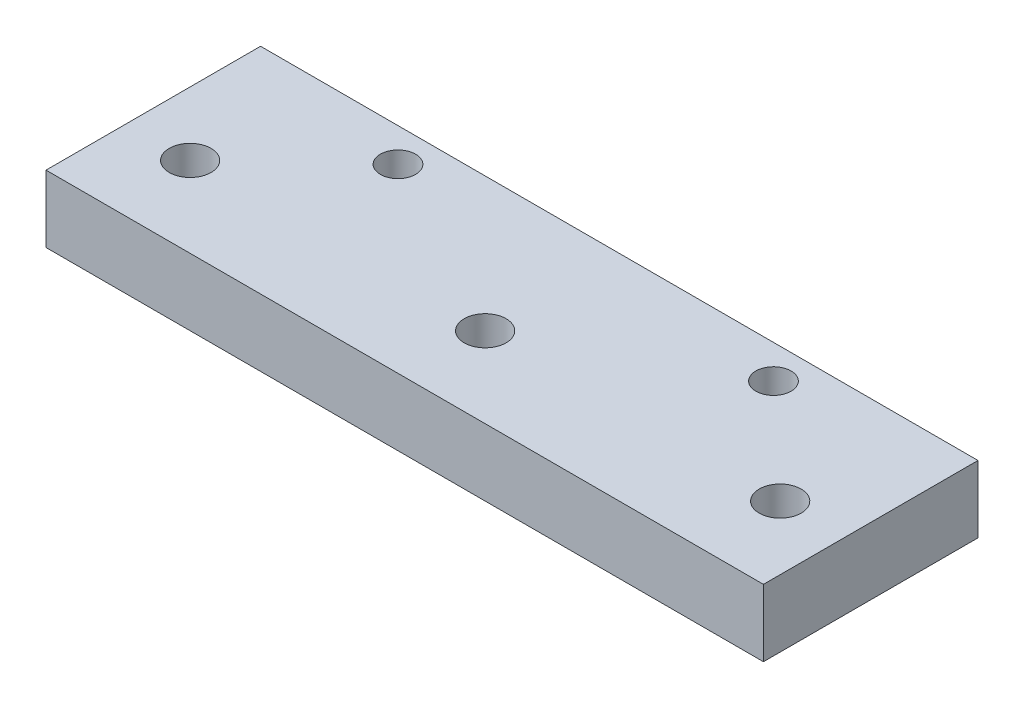
ISO-10303-21;
HEADER;
FILE_DESCRIPTION(('STEP AP214'),'2;1');
FILE_NAME('part.step','',(''),(''),'','','');
FILE_SCHEMA(('AUTOMOTIVE_DESIGN { 1 0 10303 214 1 1 1 1 }'));
ENDSEC;
DATA;
#1=APPLICATION_CONTEXT('core data for automotive mechanical design processes');
#2=APPLICATION_PROTOCOL_DEFINITION('international standard','automotive_design',2000,#1);
#3=PRODUCT_CONTEXT('',#1,'mechanical');
#4=PRODUCT('Part','Part','',(#3));
#5=PRODUCT_RELATED_PRODUCT_CATEGORY('part','',(#4));
#6=PRODUCT_DEFINITION_FORMATION('','',#4);
#7=PRODUCT_DEFINITION_CONTEXT('part definition',#1,'design');
#8=PRODUCT_DEFINITION('design','',#6,#7);
#9=PRODUCT_DEFINITION_SHAPE('','',#8);
#10=(LENGTH_UNIT() NAMED_UNIT(*) SI_UNIT(.MILLI.,.METRE.));
#11=(NAMED_UNIT(*) PLANE_ANGLE_UNIT() SI_UNIT($,.RADIAN.));
#12=(NAMED_UNIT(*) SI_UNIT($,.STERADIAN.) SOLID_ANGLE_UNIT());
#13=UNCERTAINTY_MEASURE_WITH_UNIT(LENGTH_MEASURE(1.E-05),#10,'distance_accuracy_value','');
#14=(GEOMETRIC_REPRESENTATION_CONTEXT(3) GLOBAL_UNCERTAINTY_ASSIGNED_CONTEXT((#13)) GLOBAL_UNIT_ASSIGNED_CONTEXT((#10,
#11,#12)) REPRESENTATION_CONTEXT('',''));
#15=CARTESIAN_POINT('',(0.,0.,0.));
#16=DIRECTION('',(0.,0.,1.));
#17=DIRECTION('',(1.,0.,0.));
#18=AXIS2_PLACEMENT_3D('',#15,#16,#17);
#19=CARTESIAN_POINT('',(169.8625,15.875,50.8));
#20=DIRECTION('',(-1.,0.,0.));
#21=DIRECTION('',(0.,0.,1.));
#22=AXIS2_PLACEMENT_3D('',#19,#20,#21);
#23=PLANE('',#22);
#24=DIRECTION('',(0.,0.,-1.));
#25=VECTOR('',#24,1.);
#26=CARTESIAN_POINT('',(169.8625,-15.875,50.8));
#27=LINE('',#26,#25);
#28=CARTESIAN_POINT('',(169.8625,-15.875,50.8));
#29=VERTEX_POINT('',#28);
#30=CARTESIAN_POINT('',(169.8625,-15.875,-50.8));
#31=VERTEX_POINT('',#30);
#32=EDGE_CURVE('E105',#29,#31,#27,.T.);
#33=ORIENTED_EDGE('',*,*,#32,.T.);
#34=DIRECTION('',(0.,-1.,0.));
#35=VECTOR('',#34,1.);
#36=CARTESIAN_POINT('',(169.8625,15.875,-50.8));
#37=LINE('',#36,#35);
#38=CARTESIAN_POINT('',(169.8625,15.875,-50.8));
#39=VERTEX_POINT('',#38);
#40=EDGE_CURVE('E11',#39,#31,#37,.T.);
#41=ORIENTED_EDGE('',*,*,#40,.F.);
#42=DIRECTION('',(0.,0.,-1.));
#43=VECTOR('',#42,1.);
#44=CARTESIAN_POINT('',(169.8625,15.875,50.8));
#45=LINE('',#44,#43);
#46=CARTESIAN_POINT('',(169.8625,15.875,50.8));
#47=VERTEX_POINT('',#46);
#48=EDGE_CURVE('E92',#47,#39,#45,.T.);
#49=ORIENTED_EDGE('',*,*,#48,.F.);
#50=DIRECTION('',(0.,-1.,0.));
#51=VECTOR('',#50,1.);
#52=CARTESIAN_POINT('',(169.8625,15.875,50.8));
#53=LINE('',#52,#51);
#54=EDGE_CURVE('E101',#47,#29,#53,.T.);
#55=ORIENTED_EDGE('',*,*,#54,.T.);
#56=EDGE_LOOP('',(#33,#41,#49,#55));
#57=FACE_BOUND('',#56,.T.);
#58=ADVANCED_FACE('F39',(#57),#23,.F.);
#59=CARTESIAN_POINT('',(-169.8625,15.875,-50.8));
#60=DIRECTION('',(0.,0.,1.));
#61=DIRECTION('',(1.,0.,0.));
#62=AXIS2_PLACEMENT_3D('',#59,#60,#61);
#63=PLANE('',#62);
#64=DIRECTION('',(-1.,0.,0.));
#65=VECTOR('',#64,1.);
#66=CARTESIAN_POINT('',(-169.8625,-15.875,-50.8));
#67=LINE('',#66,#65);
#68=CARTESIAN_POINT('',(-169.8625,-15.875,-50.8));
#69=VERTEX_POINT('',#68);
#70=EDGE_CURVE('E96',#31,#69,#67,.T.);
#71=ORIENTED_EDGE('',*,*,#70,.T.);
#72=DIRECTION('',(0.,-1.,0.));
#73=VECTOR('',#72,1.);
#74=CARTESIAN_POINT('',(-169.8625,15.875,-50.8));
#75=LINE('',#74,#73);
#76=CARTESIAN_POINT('',(-169.8625,15.875,-50.8));
#77=VERTEX_POINT('',#76);
#78=EDGE_CURVE('E48',#77,#69,#75,.T.);
#79=ORIENTED_EDGE('',*,*,#78,.F.);
#80=DIRECTION('',(-1.,0.,0.));
#81=VECTOR('',#80,1.);
#82=CARTESIAN_POINT('',(-169.8625,15.875,-50.8));
#83=LINE('',#82,#81);
#84=EDGE_CURVE('E87',#39,#77,#83,.T.);
#85=ORIENTED_EDGE('',*,*,#84,.F.);
#86=ORIENTED_EDGE('',*,*,#40,.T.);
#87=EDGE_LOOP('',(#71,#79,#85,#86));
#88=FACE_BOUND('',#87,.T.);
#89=ADVANCED_FACE('F95',(#88),#63,.F.);
#90=CARTESIAN_POINT('',(-169.8625,15.875,50.8));
#91=DIRECTION('',(1.,0.,0.));
#92=DIRECTION('',(0.,0.,-1.));
#93=AXIS2_PLACEMENT_3D('',#90,#91,#92);
#94=PLANE('',#93);
#95=DIRECTION('',(0.,0.,1.));
#96=VECTOR('',#95,1.);
#97=CARTESIAN_POINT('',(-169.8625,-15.875,50.8));
#98=LINE('',#97,#96);
#99=CARTESIAN_POINT('',(-169.8625,-15.875,50.8));
#100=VERTEX_POINT('',#99);
#101=EDGE_CURVE('E74',#69,#100,#98,.T.);
#102=ORIENTED_EDGE('',*,*,#101,.T.);
#103=DIRECTION('',(0.,-1.,0.));
#104=VECTOR('',#103,1.);
#105=CARTESIAN_POINT('',(-169.8625,15.875,50.8));
#106=LINE('',#105,#104);
#107=CARTESIAN_POINT('',(-169.8625,15.875,50.8));
#108=VERTEX_POINT('',#107);
#109=EDGE_CURVE('E97',#108,#100,#106,.T.);
#110=ORIENTED_EDGE('',*,*,#109,.F.);
#111=DIRECTION('',(0.,0.,1.));
#112=VECTOR('',#111,1.);
#113=CARTESIAN_POINT('',(-169.8625,15.875,50.8));
#114=LINE('',#113,#112);
#115=EDGE_CURVE('E90',#77,#108,#114,.T.);
#116=ORIENTED_EDGE('',*,*,#115,.F.);
#117=ORIENTED_EDGE('',*,*,#78,.T.);
#118=EDGE_LOOP('',(#102,#110,#116,#117));
#119=FACE_BOUND('',#118,.T.);
#120=ADVANCED_FACE('F99',(#119),#94,.F.);
#121=CARTESIAN_POINT('',(-169.8625,15.875,50.8));
#122=DIRECTION('',(0.,0.,-1.));
#123=DIRECTION('',(-1.,0.,0.));
#124=AXIS2_PLACEMENT_3D('',#121,#122,#123);
#125=PLANE('',#124);
#126=DIRECTION('',(1.,0.,0.));
#127=VECTOR('',#126,1.);
#128=CARTESIAN_POINT('',(-169.8625,-15.875,50.8));
#129=LINE('',#128,#127);
#130=EDGE_CURVE('E80',#100,#29,#129,.T.);
#131=ORIENTED_EDGE('',*,*,#130,.T.);
#132=ORIENTED_EDGE('',*,*,#54,.F.);
#133=DIRECTION('',(1.,0.,0.));
#134=VECTOR('',#133,1.);
#135=CARTESIAN_POINT('',(-169.8625,15.875,50.8));
#136=LINE('',#135,#134);
#137=EDGE_CURVE('E57',#108,#47,#136,.T.);
#138=ORIENTED_EDGE('',*,*,#137,.F.);
#139=ORIENTED_EDGE('',*,*,#109,.T.);
#140=EDGE_LOOP('',(#131,#132,#138,#139));
#141=FACE_BOUND('',#140,.T.);
#142=ADVANCED_FACE('F144',(#141),#125,.F.);
#143=CARTESIAN_POINT('',(0.,15.875,0.));
#144=DIRECTION('',(0.,-1.,0.));
#145=DIRECTION('',(0.,0.,-1.));
#146=AXIS2_PLACEMENT_3D('',#143,#144,#145);
#147=PLANE('',#146);
#148=CARTESIAN_POINT('',(-88.9127,15.875,-34.925));
#149=DIRECTION('',(0.,-1.,0.));
#150=DIRECTION('',(0.,0.,-1.));
#151=AXIS2_PLACEMENT_3D('',#148,#149,#150);
#152=CIRCLE('',#151,8.3312);
#153=CARTESIAN_POINT('',(-88.9127,15.875,-43.2562));
#154=VERTEX_POINT('',#153);
#155=EDGE_CURVE('E296',#154,#154,#152,.F.);
#156=ORIENTED_EDGE('',*,*,#155,.F.);
#157=EDGE_LOOP('',(#156));
#158=FACE_BOUND('',#157,.T.);
#159=CARTESIAN_POINT('',(88.8873,15.875,-34.925));
#160=DIRECTION('',(0.,-1.,0.));
#161=DIRECTION('',(0.,0.,-1.));
#162=AXIS2_PLACEMENT_3D('',#159,#160,#161);
#163=CIRCLE('',#162,8.3312);
#164=CARTESIAN_POINT('',(88.8873,15.875,-43.2562));
#165=VERTEX_POINT('',#164);
#166=EDGE_CURVE('E297',#165,#165,#163,.F.);
#167=ORIENTED_EDGE('',*,*,#166,.F.);
#168=EDGE_LOOP('',(#167));
#169=FACE_BOUND('',#168,.T.);
#170=CARTESIAN_POINT('',(-139.7127,15.875,12.7));
#171=DIRECTION('',(0.,-1.,0.));
#172=DIRECTION('',(0.,0.,-1.));
#173=AXIS2_PLACEMENT_3D('',#170,#171,#172);
#174=CIRCLE('',#173,9.9187);
#175=CARTESIAN_POINT('',(-139.7127,15.875,2.7813));
#176=VERTEX_POINT('',#175);
#177=EDGE_CURVE('E108',#176,#176,#174,.F.);
#178=ORIENTED_EDGE('',*,*,#177,.F.);
#179=EDGE_LOOP('',(#178));
#180=FACE_BOUND('',#179,.T.);
#181=CARTESIAN_POINT('',(-0.012699999999993,15.875,12.7));
#182=DIRECTION('',(0.,-1.,0.));
#183=DIRECTION('',(0.,0.,-1.));
#184=AXIS2_PLACEMENT_3D('',#181,#182,#183);
#185=CIRCLE('',#184,9.9187);
#186=CARTESIAN_POINT('',(-0.012699999999993,15.875,2.7813));
#187=VERTEX_POINT('',#186);
#188=EDGE_CURVE('E126',#187,#187,#185,.F.);
#189=ORIENTED_EDGE('',*,*,#188,.F.);
#190=EDGE_LOOP('',(#189));
#191=FACE_BOUND('',#190,.T.);
#192=CARTESIAN_POINT('',(139.6873,15.875,12.7));
#193=DIRECTION('',(0.,-1.,0.));
#194=DIRECTION('',(0.,0.,-1.));
#195=AXIS2_PLACEMENT_3D('',#192,#193,#194);
#196=CIRCLE('',#195,9.9187);
#197=CARTESIAN_POINT('',(139.6873,15.875,2.7813));
#198=VERTEX_POINT('',#197);
#199=EDGE_CURVE('E122',#198,#198,#196,.F.);
#200=ORIENTED_EDGE('',*,*,#199,.F.);
#201=EDGE_LOOP('',(#200));
#202=FACE_BOUND('',#201,.T.);
#203=ORIENTED_EDGE('',*,*,#48,.T.);
#204=ORIENTED_EDGE('',*,*,#84,.T.);
#205=ORIENTED_EDGE('',*,*,#115,.T.);
#206=ORIENTED_EDGE('',*,*,#137,.T.);
#207=EDGE_LOOP('',(#203,#204,#205,#206));
#208=FACE_BOUND('',#207,.T.);
#209=ADVANCED_FACE('F88',(#158,#169,#180,#191,#202,#208),#147,.F.);
#210=CARTESIAN_POINT('',(0.,-15.875,0.));
#211=DIRECTION('',(0.,-1.,0.));
#212=DIRECTION('',(0.,0.,-1.));
#213=AXIS2_PLACEMENT_3D('',#210,#211,#212);
#214=PLANE('',#213);
#215=CARTESIAN_POINT('',(-88.9127,-15.875,-34.925));
#216=DIRECTION('',(0.,1.,0.));
#217=DIRECTION('',(0.,0.,1.));
#218=AXIS2_PLACEMENT_3D('',#215,#216,#217);
#219=CIRCLE('',#218,8.3312);
#220=CARTESIAN_POINT('',(-88.9127,-15.875,-26.5938));
#221=VERTEX_POINT('',#220);
#222=EDGE_CURVE('E293',#221,#221,#219,.T.);
#223=ORIENTED_EDGE('',*,*,#222,.T.);
#224=EDGE_LOOP('',(#223));
#225=FACE_BOUND('',#224,.T.);
#226=CARTESIAN_POINT('',(88.8873,-15.875,-34.925));
#227=DIRECTION('',(0.,1.,0.));
#228=DIRECTION('',(0.,0.,1.));
#229=AXIS2_PLACEMENT_3D('',#226,#227,#228);
#230=CIRCLE('',#229,8.3312);
#231=CARTESIAN_POINT('',(88.8873,-15.875,-26.5938));
#232=VERTEX_POINT('',#231);
#233=EDGE_CURVE('E329',#232,#232,#230,.T.);
#234=ORIENTED_EDGE('',*,*,#233,.T.);
#235=EDGE_LOOP('',(#234));
#236=FACE_BOUND('',#235,.T.);
#237=CARTESIAN_POINT('',(-139.7127,-15.875,12.7));
#238=DIRECTION('',(0.,1.,0.));
#239=DIRECTION('',(0.,0.,1.));
#240=AXIS2_PLACEMENT_3D('',#237,#238,#239);
#241=CIRCLE('',#240,15.0876);
#242=CARTESIAN_POINT('',(-139.7127,-15.875,27.7876));
#243=VERTEX_POINT('',#242);
#244=EDGE_CURVE('E307',#243,#243,#241,.T.);
#245=ORIENTED_EDGE('',*,*,#244,.T.);
#246=EDGE_LOOP('',(#245));
#247=FACE_BOUND('',#246,.T.);
#248=CARTESIAN_POINT('',(-0.012699999999993,-15.875,12.7));
#249=DIRECTION('',(0.,1.,0.));
#250=DIRECTION('',(0.,0.,1.));
#251=AXIS2_PLACEMENT_3D('',#248,#249,#250);
#252=CIRCLE('',#251,15.0876);
#253=CARTESIAN_POINT('',(-0.012699999999993,-15.875,27.7876));
#254=VERTEX_POINT('',#253);
#255=EDGE_CURVE('E310',#254,#254,#252,.T.);
#256=ORIENTED_EDGE('',*,*,#255,.T.);
#257=EDGE_LOOP('',(#256));
#258=FACE_BOUND('',#257,.T.);
#259=CARTESIAN_POINT('',(139.6873,-15.875,12.7));
#260=DIRECTION('',(0.,1.,0.));
#261=DIRECTION('',(0.,0.,1.));
#262=AXIS2_PLACEMENT_3D('',#259,#260,#261);
#263=CIRCLE('',#262,15.0876);
#264=CARTESIAN_POINT('',(139.6873,-15.875,27.7876));
#265=VERTEX_POINT('',#264);
#266=EDGE_CURVE('E300',#265,#265,#263,.T.);
#267=ORIENTED_EDGE('',*,*,#266,.T.);
#268=EDGE_LOOP('',(#267));
#269=FACE_BOUND('',#268,.T.);
#270=ORIENTED_EDGE('',*,*,#32,.F.);
#271=ORIENTED_EDGE('',*,*,#130,.F.);
#272=ORIENTED_EDGE('',*,*,#101,.F.);
#273=ORIENTED_EDGE('',*,*,#70,.F.);
#274=EDGE_LOOP('',(#270,#271,#272,#273));
#275=FACE_BOUND('',#274,.T.);
#276=ADVANCED_FACE('F143',(#225,#236,#247,#258,#269,#275),#214,.T.);
#277=CARTESIAN_POINT('',(139.6873,47.625,12.7));
#278=DIRECTION('',(0.,-1.,0.));
#279=DIRECTION('',(0.,0.,-1.));
#280=AXIS2_PLACEMENT_3D('',#277,#278,#279);
#281=CYLINDRICAL_SURFACE('',#280,9.9187);
#282=CARTESIAN_POINT('',(139.6873,-12.7,12.7));
#283=DIRECTION('',(0.,1.,0.));
#284=DIRECTION('',(0.,0.,1.));
#285=AXIS2_PLACEMENT_3D('',#282,#283,#284);
#286=CIRCLE('',#285,9.9187);
#287=CARTESIAN_POINT('',(139.6873,-12.7,22.6187));
#288=VERTEX_POINT('',#287);
#289=EDGE_CURVE('E42',#288,#288,#286,.T.);
#290=ORIENTED_EDGE('',*,*,#289,.F.);
#291=EDGE_LOOP('',(#290));
#292=FACE_BOUND('',#291,.T.);
#293=ORIENTED_EDGE('',*,*,#199,.T.);
#294=EDGE_LOOP('',(#293));
#295=FACE_BOUND('',#294,.T.);
#296=ADVANCED_FACE('F152',(#292,#295),#281,.F.);
#297=CARTESIAN_POINT('',(-0.012699999999993,47.625,12.7));
#298=DIRECTION('',(0.,-1.,0.));
#299=DIRECTION('',(0.,0.,-1.));
#300=AXIS2_PLACEMENT_3D('',#297,#298,#299);
#301=CYLINDRICAL_SURFACE('',#300,9.9187);
#302=CARTESIAN_POINT('',(-0.012699999999993,-12.7,12.7));
#303=DIRECTION('',(0.,1.,0.));
#304=DIRECTION('',(0.,0.,1.));
#305=AXIS2_PLACEMENT_3D('',#302,#303,#304);
#306=CIRCLE('',#305,9.9187);
#307=CARTESIAN_POINT('',(-0.012699999999993,-12.7,22.6187));
#308=VERTEX_POINT('',#307);
#309=EDGE_CURVE('E116',#308,#308,#306,.T.);
#310=ORIENTED_EDGE('',*,*,#309,.F.);
#311=EDGE_LOOP('',(#310));
#312=FACE_BOUND('',#311,.T.);
#313=ORIENTED_EDGE('',*,*,#188,.T.);
#314=EDGE_LOOP('',(#313));
#315=FACE_BOUND('',#314,.T.);
#316=ADVANCED_FACE('F150',(#312,#315),#301,.F.);
#317=CARTESIAN_POINT('',(-139.7127,47.625,12.7));
#318=DIRECTION('',(0.,-1.,0.));
#319=DIRECTION('',(0.,0.,-1.));
#320=AXIS2_PLACEMENT_3D('',#317,#318,#319);
#321=CYLINDRICAL_SURFACE('',#320,9.9187);
#322=CARTESIAN_POINT('',(-139.7127,-12.7,12.7));
#323=DIRECTION('',(0.,1.,0.));
#324=DIRECTION('',(0.,0.,1.));
#325=AXIS2_PLACEMENT_3D('',#322,#323,#324);
#326=CIRCLE('',#325,9.9187);
#327=CARTESIAN_POINT('',(-139.7127,-12.7,22.6187));
#328=VERTEX_POINT('',#327);
#329=EDGE_CURVE('E114',#328,#328,#326,.T.);
#330=ORIENTED_EDGE('',*,*,#329,.F.);
#331=EDGE_LOOP('',(#330));
#332=FACE_BOUND('',#331,.T.);
#333=ORIENTED_EDGE('',*,*,#177,.T.);
#334=EDGE_LOOP('',(#333));
#335=FACE_BOUND('',#334,.T.);
#336=ADVANCED_FACE('F139',(#332,#335),#321,.F.);
#337=CARTESIAN_POINT('',(-139.7127,-12.7,12.7));
#338=DIRECTION('',(0.,-1.,0.));
#339=DIRECTION('',(0.,0.,-1.));
#340=AXIS2_PLACEMENT_3D('',#337,#338,#339);
#341=CYLINDRICAL_SURFACE('',#340,15.0876);
#342=CARTESIAN_POINT('',(-139.7127,-12.7,12.7));
#343=DIRECTION('',(0.,1.,0.));
#344=DIRECTION('',(0.,0.,1.));
#345=AXIS2_PLACEMENT_3D('',#342,#343,#344);
#346=CIRCLE('',#345,15.0876);
#347=CARTESIAN_POINT('',(-139.7127,-12.7,27.7876));
#348=VERTEX_POINT('',#347);
#349=EDGE_CURVE('E117',#348,#348,#346,.T.);
#350=ORIENTED_EDGE('',*,*,#349,.T.);
#351=EDGE_LOOP('',(#350));
#352=FACE_BOUND('',#351,.T.);
#353=ORIENTED_EDGE('',*,*,#244,.F.);
#354=EDGE_LOOP('',(#353));
#355=FACE_BOUND('',#354,.T.);
#356=ADVANCED_FACE('F159',(#352,#355),#341,.F.);
#357=CARTESIAN_POINT('',(-139.7127,-12.7,12.7));
#358=DIRECTION('',(0.,1.,0.));
#359=DIRECTION('',(0.,0.,1.));
#360=AXIS2_PLACEMENT_3D('',#357,#358,#359);
#361=PLANE('',#360);
#362=ORIENTED_EDGE('',*,*,#329,.T.);
#363=EDGE_LOOP('',(#362));
#364=FACE_BOUND('',#363,.T.);
#365=ORIENTED_EDGE('',*,*,#349,.F.);
#366=EDGE_LOOP('',(#365));
#367=FACE_BOUND('',#366,.T.);
#368=ADVANCED_FACE('F221',(#364,#367),#361,.F.);
#369=CARTESIAN_POINT('',(-0.012699999999993,-12.7,12.7));
#370=DIRECTION('',(0.,-1.,0.));
#371=DIRECTION('',(0.,0.,-1.));
#372=AXIS2_PLACEMENT_3D('',#369,#370,#371);
#373=CYLINDRICAL_SURFACE('',#372,15.0876);
#374=CARTESIAN_POINT('',(-0.012699999999993,-12.7,12.7));
#375=DIRECTION('',(0.,1.,0.));
#376=DIRECTION('',(0.,0.,1.));
#377=AXIS2_PLACEMENT_3D('',#374,#375,#376);
#378=CIRCLE('',#377,15.0876);
#379=CARTESIAN_POINT('',(-0.012699999999993,-12.7,27.7876));
#380=VERTEX_POINT('',#379);
#381=EDGE_CURVE('E313',#380,#380,#378,.T.);
#382=ORIENTED_EDGE('',*,*,#381,.T.);
#383=EDGE_LOOP('',(#382));
#384=FACE_BOUND('',#383,.T.);
#385=ORIENTED_EDGE('',*,*,#255,.F.);
#386=EDGE_LOOP('',(#385));
#387=FACE_BOUND('',#386,.T.);
#388=ADVANCED_FACE('F231',(#384,#387),#373,.F.);
#389=CARTESIAN_POINT('',(-0.012699999999993,-12.7,12.7));
#390=DIRECTION('',(0.,1.,0.));
#391=DIRECTION('',(0.,0.,1.));
#392=AXIS2_PLACEMENT_3D('',#389,#390,#391);
#393=PLANE('',#392);
#394=ORIENTED_EDGE('',*,*,#309,.T.);
#395=EDGE_LOOP('',(#394));
#396=FACE_BOUND('',#395,.T.);
#397=ORIENTED_EDGE('',*,*,#381,.F.);
#398=EDGE_LOOP('',(#397));
#399=FACE_BOUND('',#398,.T.);
#400=ADVANCED_FACE('F241',(#396,#399),#393,.F.);
#401=CARTESIAN_POINT('',(139.6873,-12.7,12.7));
#402=DIRECTION('',(0.,-1.,0.));
#403=DIRECTION('',(0.,0.,-1.));
#404=AXIS2_PLACEMENT_3D('',#401,#402,#403);
#405=CYLINDRICAL_SURFACE('',#404,15.0876);
#406=CARTESIAN_POINT('',(139.6873,-12.7,12.7));
#407=DIRECTION('',(0.,1.,0.));
#408=DIRECTION('',(0.,0.,1.));
#409=AXIS2_PLACEMENT_3D('',#406,#407,#408);
#410=CIRCLE('',#409,15.0876);
#411=CARTESIAN_POINT('',(139.6873,-12.7,27.7876));
#412=VERTEX_POINT('',#411);
#413=EDGE_CURVE('E133',#412,#412,#410,.T.);
#414=ORIENTED_EDGE('',*,*,#413,.T.);
#415=EDGE_LOOP('',(#414));
#416=FACE_BOUND('',#415,.T.);
#417=ORIENTED_EDGE('',*,*,#266,.F.);
#418=EDGE_LOOP('',(#417));
#419=FACE_BOUND('',#418,.T.);
#420=ADVANCED_FACE('F251',(#416,#419),#405,.F.);
#421=CARTESIAN_POINT('',(139.6873,-12.7,12.7));
#422=DIRECTION('',(0.,1.,0.));
#423=DIRECTION('',(0.,0.,1.));
#424=AXIS2_PLACEMENT_3D('',#421,#422,#423);
#425=PLANE('',#424);
#426=ORIENTED_EDGE('',*,*,#289,.T.);
#427=EDGE_LOOP('',(#426));
#428=FACE_BOUND('',#427,.T.);
#429=ORIENTED_EDGE('',*,*,#413,.F.);
#430=EDGE_LOOP('',(#429));
#431=FACE_BOUND('',#430,.T.);
#432=ADVANCED_FACE('F260',(#428,#431),#425,.F.);
#433=CARTESIAN_POINT('',(88.8873,47.625,-34.925));
#434=DIRECTION('',(0.,-1.,0.));
#435=DIRECTION('',(0.,0.,-1.));
#436=AXIS2_PLACEMENT_3D('',#433,#434,#435);
#437=CYLINDRICAL_SURFACE('',#436,8.3312);
#438=ORIENTED_EDGE('',*,*,#233,.F.);
#439=EDGE_LOOP('',(#438));
#440=FACE_BOUND('',#439,.T.);
#441=ORIENTED_EDGE('',*,*,#166,.T.);
#442=EDGE_LOOP('',(#441));
#443=FACE_BOUND('',#442,.T.);
#444=ADVANCED_FACE('F270',(#440,#443),#437,.F.);
#445=CARTESIAN_POINT('',(-88.9127,47.625,-34.925));
#446=DIRECTION('',(0.,-1.,0.));
#447=DIRECTION('',(0.,0.,-1.));
#448=AXIS2_PLACEMENT_3D('',#445,#446,#447);
#449=CYLINDRICAL_SURFACE('',#448,8.3312);
#450=ORIENTED_EDGE('',*,*,#222,.F.);
#451=EDGE_LOOP('',(#450));
#452=FACE_BOUND('',#451,.T.);
#453=ORIENTED_EDGE('',*,*,#155,.T.);
#454=EDGE_LOOP('',(#453));
#455=FACE_BOUND('',#454,.T.);
#456=ADVANCED_FACE('F278',(#452,#455),#449,.F.);
#457=CLOSED_SHELL('',(#58,#89,#120,#142,#209,#276,#296,#316,#336,#356,#368,#388,#400,#420,#432,
#444,#456));
#458=MANIFOLD_SOLID_BREP('B2',#457);
#459=ADVANCED_BREP_SHAPE_REPRESENTATION('',(#18,#458),#14);
#460=SHAPE_DEFINITION_REPRESENTATION(#9,#459);
ENDSEC;
END-ISO-10303-21;
